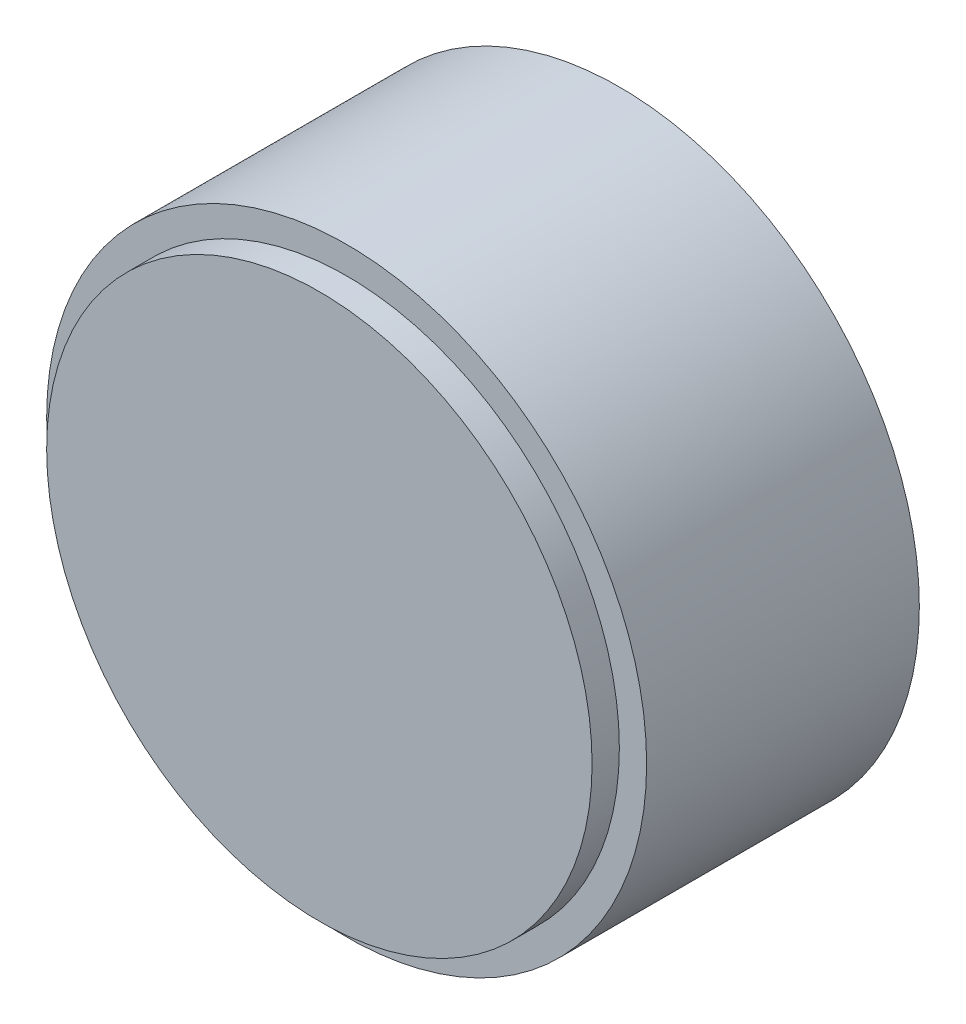
ISO-10303-21;
HEADER;
FILE_DESCRIPTION(('STEP AP214'),'2;1');
FILE_NAME('part.step','',(''),(''),'','','');
FILE_SCHEMA(('AUTOMOTIVE_DESIGN { 1 0 10303 214 1 1 1 1 }'));
ENDSEC;
DATA;
#1=APPLICATION_CONTEXT('core data for automotive mechanical design processes');
#2=APPLICATION_PROTOCOL_DEFINITION('international standard','automotive_design',2000,#1);
#3=PRODUCT_CONTEXT('',#1,'mechanical');
#4=PRODUCT('Part','Part','',(#3));
#5=PRODUCT_RELATED_PRODUCT_CATEGORY('part','',(#4));
#6=PRODUCT_DEFINITION_FORMATION('','',#4);
#7=PRODUCT_DEFINITION_CONTEXT('part definition',#1,'design');
#8=PRODUCT_DEFINITION('design','',#6,#7);
#9=PRODUCT_DEFINITION_SHAPE('','',#8);
#10=(LENGTH_UNIT() NAMED_UNIT(*) SI_UNIT(.MILLI.,.METRE.));
#11=(NAMED_UNIT(*) PLANE_ANGLE_UNIT() SI_UNIT($,.RADIAN.));
#12=(NAMED_UNIT(*) SI_UNIT($,.STERADIAN.) SOLID_ANGLE_UNIT());
#13=UNCERTAINTY_MEASURE_WITH_UNIT(LENGTH_MEASURE(1.E-05),#10,'distance_accuracy_value','');
#14=(GEOMETRIC_REPRESENTATION_CONTEXT(3) GLOBAL_UNCERTAINTY_ASSIGNED_CONTEXT((#13)) GLOBAL_UNIT_ASSIGNED_CONTEXT((#10,
#11,#12)) REPRESENTATION_CONTEXT('',''));
#15=CARTESIAN_POINT('',(0.,0.,0.));
#16=DIRECTION('',(0.,0.,1.));
#17=DIRECTION('',(1.,0.,0.));
#18=AXIS2_PLACEMENT_3D('',#15,#16,#17);
#19=CARTESIAN_POINT('',(0.,0.,-5.));
#20=DIRECTION('',(0.,0.,1.));
#21=DIRECTION('',(1.,0.,0.));
#22=AXIS2_PLACEMENT_3D('',#19,#20,#21);
#23=CYLINDRICAL_SURFACE('',#22,7.);
#24=CARTESIAN_POINT('',(0.,0.,-5.));
#25=DIRECTION('',(0.,0.,-1.));
#26=DIRECTION('',(-1.,0.,0.));
#27=AXIS2_PLACEMENT_3D('',#24,#25,#26);
#28=CIRCLE('',#27,7.);
#29=CARTESIAN_POINT('',(-7.,0.,-5.));
#30=VERTEX_POINT('',#29);
#31=EDGE_CURVE('E53',#30,#30,#28,.T.);
#32=ORIENTED_EDGE('',*,*,#31,.F.);
#33=EDGE_LOOP('',(#32));
#34=FACE_BOUND('',#33,.T.);
#35=CARTESIAN_POINT('',(0.,0.,0.));
#36=DIRECTION('',(0.,0.,-1.));
#37=DIRECTION('',(-1.,0.,0.));
#38=AXIS2_PLACEMENT_3D('',#35,#36,#37);
#39=CIRCLE('',#38,7.);
#40=CARTESIAN_POINT('',(-7.,0.,0.));
#41=VERTEX_POINT('',#40);
#42=EDGE_CURVE('E10',#41,#41,#39,.T.);
#43=ORIENTED_EDGE('',*,*,#42,.T.);
#44=EDGE_LOOP('',(#43));
#45=FACE_BOUND('',#44,.T.);
#46=CARTESIAN_POINT('',(0.,7.,-4.));
#47=CARTESIAN_POINT('',(-0.0832358860906166,6.99999846043226,-3.9999971004257));
#48=CARTESIAN_POINT('',(-0.166507195600275,6.9985002594971,-3.99304839161214));
#49=CARTESIAN_POINT('',(-0.330687344293327,6.99266829827728,-3.96546434314641));
#50=CARTESIAN_POINT('',(-0.41159440357119,6.98833245637099,-3.94481895580507));
#51=CARTESIAN_POINT('',(-0.568649323817737,6.97730831788827,-3.89051563539196));
#52=CARTESIAN_POINT('',(-0.644801963446556,6.97062242967171,-3.85687102061868));
#53=CARTESIAN_POINT('',(-0.790378177960787,6.95562106817971,-3.77756591382874));
#54=CARTESIAN_POINT('',(-0.859801981747369,6.94730565036661,-3.73190583075006));
#55=CARTESIAN_POINT('',(-0.991024790535229,6.92981369246311,-3.62911970032649));
#56=CARTESIAN_POINT('',(-1.05270503419445,6.92062683143259,-3.57184377810147));
#57=CARTESIAN_POINT('',(-1.16566042389435,6.90250069814144,-3.4477736843148));
#58=CARTESIAN_POINT('',(-1.21693467150908,6.8935614473163,-3.38097869174874));
#59=CARTESIAN_POINT('',(-1.30814204379809,6.87684116047225,-3.23889424713957));
#60=CARTESIAN_POINT('',(-1.34794958335009,6.8690733634436,-3.16352248224379));
#61=CARTESIAN_POINT('',(-1.41428823691148,6.85572325558537,-3.00696554623316));
#62=CARTESIAN_POINT('',(-1.44082087001716,6.85014069470711,-2.92578104150743));
#63=CARTESIAN_POINT('',(-1.47946574422454,6.84189808926311,-2.76118891341192));
#64=CARTESIAN_POINT('',(-1.49178779748342,6.83919556896486,-2.67783272433613));
#65=CARTESIAN_POINT('',(-1.50231395206577,6.83689139845106,-2.510195767493));
#66=CARTESIAN_POINT('',(-1.50051971664629,6.83728938291729,-2.42591510982005));
#67=CARTESIAN_POINT('',(-1.48303326340861,6.84110276603832,-2.26037531206621));
#68=CARTESIAN_POINT('',(-1.46758398649408,6.84446541682162,-2.17908911089985));
#69=CARTESIAN_POINT('',(-1.42361054298677,6.85374593375788,-2.02028975971066));
#70=CARTESIAN_POINT('',(-1.39508566936466,6.85966393808402,-1.94277681396768));
#71=CARTESIAN_POINT('',(-1.32554551075991,6.87344080755724,-1.79303712712666));
#72=CARTESIAN_POINT('',(-1.2844361097283,6.88131420983365,-1.72085548728745));
#73=CARTESIAN_POINT('',(-1.19096007283993,6.89810572501288,-1.58432483504204));
#74=CARTESIAN_POINT('',(-1.13859196103562,6.90702397481896,-1.5199768513138));
#75=CARTESIAN_POINT('',(-1.0227954275532,6.92512718393878,-1.3995406443266));
#76=CARTESIAN_POINT('',(-0.959160233964409,6.93431383972178,-1.34365129341526));
#77=CARTESIAN_POINT('',(-0.823317306269096,6.95175017497059,-1.24330626631034));
#78=CARTESIAN_POINT('',(-0.751109428775399,6.95999983875972,-1.19885078139961));
#79=CARTESIAN_POINT('',(-0.599933462049958,6.97465778534003,-1.12258932009307));
#80=CARTESIAN_POINT('',(-0.520952258863482,6.98106238643354,-1.09080858742202));
#81=CARTESIAN_POINT('',(-0.358603146685706,6.99128109245334,-1.04102435167891));
#82=CARTESIAN_POINT('',(-0.275235851133668,6.99509555860384,-1.02301892743668));
#83=CARTESIAN_POINT('',(-0.108187670836628,6.99965306347808,-1.00158378585658));
#84=CARTESIAN_POINT('',(-0.0245431772716141,7.00045336521066,-0.99788228711822));
#85=CARTESIAN_POINT('',(0.142168973650405,6.99905248935969,-1.00442457112516));
#86=CARTESIAN_POINT('',(0.225236668127256,6.99685150675698,-1.01466744796294));
#87=CARTESIAN_POINT('',(0.387542537982806,6.98973143045266,-1.0485822436617));
#88=CARTESIAN_POINT('',(0.466811712908478,6.9848410504546,-1.07211236947253));
#89=CARTESIAN_POINT('',(0.620278450473418,6.9728892442151,-1.13177694299482));
#90=CARTESIAN_POINT('',(0.69447559258774,6.96582763822237,-1.16791243431165));
#91=CARTESIAN_POINT('',(0.836821397964754,6.950175043904,-1.25233354306033));
#92=CARTESIAN_POINT('',(0.90487257511114,6.94156431354275,-1.30077979490973));
#93=CARTESIAN_POINT('',(1.0319769255236,6.92381033034847,-1.40823482488874));
#94=CARTESIAN_POINT('',(1.091028978692,6.91466701142097,-1.46724491588744));
#95=CARTESIAN_POINT('',(1.19952711057989,6.89668172706324,-1.59539737018714));
#96=CARTESIAN_POINT('',(1.24878537255157,6.88784792221285,-1.6647000992221));
#97=CARTESIAN_POINT('',(1.3349641538604,6.87166654559681,-1.81075459647799));
#98=CARTESIAN_POINT('',(1.37188519913706,6.86431891048055,-1.88750604697749));
#99=CARTESIAN_POINT('',(1.43209741248548,6.8520100980739,-2.0458722989946));
#100=CARTESIAN_POINT('',(1.45546398641275,6.84703574582967,-2.12745735643067));
#101=CARTESIAN_POINT('',(1.48812696085335,6.84001186708418,-2.29351558383364));
#102=CARTESIAN_POINT('',(1.49742550780258,6.83796189439706,-2.37798831120132));
#103=CARTESIAN_POINT('',(1.5015999992604,6.83704618848155,-2.54553234317524));
#104=CARTESIAN_POINT('',(1.49677347258311,6.83811476518543,-2.62859601498058));
#105=CARTESIAN_POINT('',(1.47349789406331,6.8431676318483,-2.79269724213259));
#106=CARTESIAN_POINT('',(1.45504898957979,6.84715189026714,-2.87373481938657));
#107=CARTESIAN_POINT('',(1.40519345940434,6.85755581104157,-3.03125865786917));
#108=CARTESIAN_POINT('',(1.37382847170887,6.86396764224703,-3.10775864866429));
#109=CARTESIAN_POINT('',(1.29906751595601,6.87850764590649,-3.25445537250685));
#110=CARTESIAN_POINT('',(1.255670353015,6.88663598880363,-3.32465147861504));
#111=CARTESIAN_POINT('',(1.15708290349304,6.90389055593232,-3.45821819372537));
#112=CARTESIAN_POINT('',(1.10167987421237,6.91303309938926,-3.52142969594698));
#113=CARTESIAN_POINT('',(0.981086554619619,6.93117449799694,-3.63775626252046));
#114=CARTESIAN_POINT('',(0.915894009385596,6.94017331951296,-3.69086899431221));
#115=CARTESIAN_POINT('',(0.776603147268716,6.95714491048987,-3.78611595950556));
#116=CARTESIAN_POINT('',(0.702404846009641,6.96510364570626,-3.82810660623098));
#117=CARTESIAN_POINT('',(0.547850160940598,6.97895826104019,-3.89895452890618));
#118=CARTESIAN_POINT('',(0.467499105863879,6.98485590212343,-3.92782302258504));
#119=CARTESIAN_POINT('',(0.322535217553203,6.99284848461772,-3.96635218513115));
#120=CARTESIAN_POINT('',(0.258717205545978,6.99551391888263,-3.97894643398003));
#121=CARTESIAN_POINT('',(0.129939960853846,6.99909024154719,-3.99577130171167));
#122=CARTESIAN_POINT('',(0.0649807750887446,7.00000120191314,-4.00000226364606));
#123=CARTESIAN_POINT('',(0.,7.,-4.));
#124=B_SPLINE_CURVE_WITH_KNOTS('',3,(#46,#47,#48,#49,#50,#51,#52,#53,#54,#55,#56,#57,#58,#59,
#60,#61,#62,#63,#64,#65,#66,#67,#68,#69,#70,#71,#72,#73,#74,#75,#76,#77,#78,#79,#80,#81,#82,#83,
#84,#85,#86,#87,#88,#89,#90,#91,#92,#93,#94,#95,#96,#97,#98,#99,#100,#101,#102,#103,#104,#105,
#106,#107,#108,#109,#110,#111,#112,#113,#114,#115,#116,#117,#118,#119,#120,#121,#122,#123),
.UNSPECIFIED.,.T.,.F.,(4,2,2,2,2,2,2,2,2,2,2,2,2,2,2,2,2,2,2,2,2,2,2,2,2,2,2,2,2,2,2,2,2,2,2,2,
2,2,4),(0.,0.249469836512082,0.499122883219936,0.748520824425602,0.997910278645886,
1.25074961881732,1.50361077918506,1.7591442921451,2.0146485567749,2.26633008124666,
2.51798195169165,2.76524475452928,3.01252092904568,3.26169356165968,3.51089887920889,
3.76527011050291,4.0196455970235,4.27452521139806,4.52936927256343,4.77934665704185,
5.02930780231429,5.27665060589267,5.52401389198434,5.77478733867803,6.02559197304485,
6.28082063283534,6.53603841075806,6.78982240408475,7.04356767229185,7.29200680540294,
7.5404432510827,7.78808499706785,8.03575134451623,8.28822950154114,8.54076590397115,
8.79641910357222,9.05185334010271,9.24661799132294,9.44137465337336),.UNSPECIFIED.);
#125=CARTESIAN_POINT('',(0.,7.,-4.));
#126=VERTEX_POINT('',#125);
#127=EDGE_CURVE('E103',#126,#126,#124,.T.);
#128=ORIENTED_EDGE('',*,*,#127,.F.);
#129=EDGE_LOOP('',(#128));
#130=FACE_BOUND('',#129,.T.);
#131=ADVANCED_FACE('F32',(#34,#45,#130),#23,.T.);
#132=CARTESIAN_POINT('',(0.,0.,-5.));
#133=DIRECTION('',(0.,0.,1.));
#134=DIRECTION('',(1.,0.,0.));
#135=AXIS2_PLACEMENT_3D('',#132,#133,#134);
#136=CYLINDRICAL_SURFACE('',#135,2.);
#137=CARTESIAN_POINT('',(0.,0.,0.));
#138=DIRECTION('',(0.,0.,-1.));
#139=DIRECTION('',(-1.,0.,0.));
#140=AXIS2_PLACEMENT_3D('',#137,#138,#139);
#141=CIRCLE('',#140,2.);
#142=CARTESIAN_POINT('',(-2.,0.,0.));
#143=VERTEX_POINT('',#142);
#144=EDGE_CURVE('E109',#143,#143,#141,.T.);
#145=ORIENTED_EDGE('',*,*,#144,.F.);
#146=EDGE_LOOP('',(#145));
#147=FACE_BOUND('',#146,.T.);
#148=CARTESIAN_POINT('',(0.,0.,-5.));
#149=DIRECTION('',(0.,0.,-1.));
#150=DIRECTION('',(-1.,0.,0.));
#151=AXIS2_PLACEMENT_3D('',#148,#149,#150);
#152=CIRCLE('',#151,2.);
#153=CARTESIAN_POINT('',(-2.,0.,-5.));
#154=VERTEX_POINT('',#153);
#155=EDGE_CURVE('E110',#154,#154,#152,.T.);
#156=ORIENTED_EDGE('',*,*,#155,.T.);
#157=EDGE_LOOP('',(#156));
#158=FACE_BOUND('',#157,.T.);
#159=CARTESIAN_POINT('',(0.,2.,-4.));
#160=CARTESIAN_POINT('',(-0.0732207358411543,1.99999540196395,-3.99999520798798));
#161=CARTESIAN_POINT('',(-0.146561062021485,1.99593645526274,-3.9945949756255));
#162=CARTESIAN_POINT('',(-0.290936396286467,1.98006607281083,-3.97333293658984));
#163=CARTESIAN_POINT('',(-0.361965136229004,1.96823514679854,-3.95744482834995));
#164=CARTESIAN_POINT('',(-0.499234626631249,1.9379567495606,-3.91628709071623));
#165=CARTESIAN_POINT('',(-0.565501615403737,1.91954951932009,-3.89107448643083));
#166=CARTESIAN_POINT('',(-0.692422335520753,1.87750556721694,-3.83245765581277));
#167=CARTESIAN_POINT('',(-0.753077701796332,1.85387037535483,-3.79905582580648));
#168=CARTESIAN_POINT('',(-0.873465937590145,1.80049544543983,-3.72173698840918));
#169=CARTESIAN_POINT('',(-0.932593229272032,1.7703930854844,-3.67713267066593));
#170=CARTESIAN_POINT('',(-1.04302716767671,1.70767017883378,-3.58050416263883));
#171=CARTESIAN_POINT('',(-1.09432148272226,1.67504578078609,-3.52846851720017));
#172=CARTESIAN_POINT('',(-1.19837161436623,1.6027112365199,-3.40641704672163));
#173=CARTESIAN_POINT('',(-1.24930578421204,1.56290854864639,-3.3348963228783));
#174=CARTESIAN_POINT('',(-1.33861998176348,1.48711444664135,-3.18254898763345));
#175=CARTESIAN_POINT('',(-1.37701716983077,1.45111786883675,-3.10173530299969));
#176=CARTESIAN_POINT('',(-1.42880627811788,1.39977155180179,-2.96049716132377));
#177=CARTESIAN_POINT('',(-1.44625674456539,1.38157751186733,-2.90260930287162));
#178=CARTESIAN_POINT('',(-1.47420672564844,1.35171594150685,-2.78360726521508));
#179=CARTESIAN_POINT('',(-1.48472215355267,1.34003347910832,-2.72250082212521));
#180=CARTESIAN_POINT('',(-1.49812822141445,1.32503759684553,-2.59781741446923));
#181=CARTESIAN_POINT('',(-1.50094954854207,1.32180026676597,-2.53422319327594));
#182=CARTESIAN_POINT('',(-1.49848213241869,1.32459531776068,-2.40738508911843));
#183=CARTESIAN_POINT('',(-1.49319048157349,1.33063102218113,-2.34414133991256));
#184=CARTESIAN_POINT('',(-1.47597739291882,1.34967623262519,-2.22680865257421));
#185=CARTESIAN_POINT('',(-1.46482486380817,1.36187157059871,-2.17246362895382));
#186=CARTESIAN_POINT('',(-1.43705671120732,1.39114192844939,-2.06656112127912));
#187=CARTESIAN_POINT('',(-1.42043583681172,1.40822163640769,-2.0150063721764));
#188=CARTESIAN_POINT('',(-1.37033064172535,1.45741769294306,-1.88374361336585));
#189=CARTESIAN_POINT('',(-1.3328014849398,1.49225649139233,-1.80659958335649));
#190=CARTESIAN_POINT('',(-1.24618023314519,1.56533298145196,-1.66080347613092));
#191=CARTESIAN_POINT('',(-1.19706004255878,1.60357878886109,-1.59217266074534));
#192=CARTESIAN_POINT('',(-1.08651604102135,1.68051672313145,-1.46224660959635));
#193=CARTESIAN_POINT('',(-1.02481375526036,1.71919586730239,-1.40117939311852));
#194=CARTESIAN_POINT('',(-0.890422521709589,1.79248037980972,-1.28973635321884));
#195=CARTESIAN_POINT('',(-0.817755054293756,1.8270934826376,-1.23934007976962));
#196=CARTESIAN_POINT('',(-0.677902080454142,1.88279726073643,-1.16001920075967));
#197=CARTESIAN_POINT('',(-0.612539870185619,1.90520770945008,-1.12881540578422));
#198=CARTESIAN_POINT('',(-0.476352173202086,1.94372904416948,-1.07577511953614));
#199=CARTESIAN_POINT('',(-0.405530141063765,1.95984387504352,-1.05393276150072));
#200=CARTESIAN_POINT('',(-0.259676232483518,1.98445588635989,-1.02074663711356));
#201=CARTESIAN_POINT('',(-0.184621281405942,1.99290592971749,-1.00946782106137));
#202=CARTESIAN_POINT('',(-0.0332012397969162,2.00115883659445,-0.998450402628294));
#203=CARTESIAN_POINT('',(0.0431632843727241,2.00096534845408,-0.998706931304634));
#204=CARTESIAN_POINT('',(0.186804217329626,1.99242547175873,-1.01011086927319));
#205=CARTESIAN_POINT('',(0.254222327546133,1.98490086600401,-1.02016053688867));
#206=CARTESIAN_POINT('',(0.386110670609118,1.96351320201588,-1.04897378000787));
#207=CARTESIAN_POINT('',(0.450580272987261,1.94964879507262,-1.06773920968941));
#208=CARTESIAN_POINT('',(0.57741677968977,1.91599830683313,-1.1138875305931));
#209=CARTESIAN_POINT('',(0.639629172536139,1.89602050290193,-1.1415511814274));
#210=CARTESIAN_POINT('',(0.758518527043073,1.85166985411963,-1.20417245542559));
#211=CARTESIAN_POINT('',(0.815194721336403,1.82729640132068,-1.23913108763974));
#212=CARTESIAN_POINT('',(0.931511626319037,1.77119146886499,-1.32178324641056));
#213=CARTESIAN_POINT('',(0.990066762698702,1.73891095025037,-1.37062853943746));
#214=CARTESIAN_POINT('',(1.09871974855854,1.67238952874785,-1.47600875258839));
#215=CARTESIAN_POINT('',(1.14879830469577,1.63814438507395,-1.53256069969336));
#216=CARTESIAN_POINT('',(1.24877541075626,1.56369128291497,-1.66414988096118));
#217=CARTESIAN_POINT('',(1.29683043648705,1.523587185201,-1.7406575614923));
#218=CARTESIAN_POINT('',(1.37923235998283,1.4494059134845,-1.90336007797245));
#219=CARTESIAN_POINT('',(1.41362000515519,1.41531099570969,-1.98952512190858));
#220=CARTESIAN_POINT('',(1.45615734256767,1.37118877808583,-2.13541444887448));
#221=CARTESIAN_POINT('',(1.46931009512996,1.35695811824565,-2.19239112640238));
#222=CARTESIAN_POINT('',(1.48891522181906,1.33542056103011,-2.30870704698318));
#223=CARTESIAN_POINT('',(1.4953825519924,1.32809821220233,-2.36804070680225));
#224=CARTESIAN_POINT('',(1.50115320209064,1.32157601792209,-2.48782907981133));
#225=CARTESIAN_POINT('',(1.50042015325262,1.32241740684975,-2.54828794300957));
#226=CARTESIAN_POINT('',(1.49176883838219,1.33216448543666,-2.66805683875216));
#227=CARTESIAN_POINT('',(1.48384130024584,1.34108058157484,-2.72736528789726));
#228=CARTESIAN_POINT('',(1.45893841819723,1.36817348797773,-2.8559145714108));
#229=CARTESIAN_POINT('',(1.44036567954111,1.38794705950643,-2.92449718013277));
#230=CARTESIAN_POINT('',(1.39469627266119,1.4338296338541,-3.05653484883048));
#231=CARTESIAN_POINT('',(1.3675780729773,1.4599546014693,-3.11997644203819));
#232=CARTESIAN_POINT('',(1.29498918933642,1.52516477328824,-3.26252063048633));
#233=CARTESIAN_POINT('',(1.2464154206597,1.56560203191105,-3.33942158275575));
#234=CARTESIAN_POINT('',(1.13650718465936,1.64713510181273,-3.48312604497756));
#235=CARTESIAN_POINT('',(1.07516134758577,1.68823146954222,-3.54992046594485));
#236=CARTESIAN_POINT('',(0.93962714493789,1.76728988939793,-3.67283184228333));
#237=CARTESIAN_POINT('',(0.865337161562859,1.80522333711072,-3.7288563193772));
#238=CARTESIAN_POINT('',(0.705159098936202,1.87357289668097,-3.82722305114535));
#239=CARTESIAN_POINT('',(0.619299420401793,1.90400691592959,-3.86959797457251));
#240=CARTESIAN_POINT('',(0.464840290356453,1.94636704624048,-3.92779942098571));
#241=CARTESIAN_POINT('',(0.398553614774731,1.96110322499718,-3.94776673137617));
#242=CARTESIAN_POINT('',(0.262841610392759,1.98383739970238,-3.97841790261149));
#243=CARTESIAN_POINT('',(0.193425623834904,1.99185421210894,-3.98912769024996));
#244=CARTESIAN_POINT('',(0.102963309861888,1.99745471706309,-3.99660469421435));
#245=CARTESIAN_POINT('',(0.0824069459941229,1.9984076143208,-3.99787627748942));
#246=CARTESIAN_POINT('',(0.0412368896243779,1.99968095423138,-3.99957467323097));
#247=CARTESIAN_POINT('',(0.0206231884283879,2.00000129507253,-4.00000134970737));
#248=CARTESIAN_POINT('',(0.,2.,-4.));
#249=B_SPLINE_CURVE_WITH_KNOTS('',3,(#159,#160,#161,#162,#163,#164,#165,#166,#167,#168,#169,
#170,#171,#172,#173,#174,#175,#176,#177,#178,#179,#180,#181,#182,#183,#184,#185,#186,#187,#188,
#189,#190,#191,#192,#193,#194,#195,#196,#197,#198,#199,#200,#201,#202,#203,#204,#205,#206,#207,
#208,#209,#210,#211,#212,#213,#214,#215,#216,#217,#218,#219,#220,#221,#222,#223,#224,#225,#226,
#227,#228,#229,#230,#231,#232,#233,#234,#235,#236,#237,#238,#239,#240,#241,#242,#243,#244,#245,
#246,#247,#248),.UNSPECIFIED.,.T.,.F.,(4,2,2,2,2,2,2,2,2,2,2,2,2,2,2,2,2,2,2,2,2,2,2,2,2,2,2,2,
2,2,2,2,2,2,2,2,2,2,2,2,2,2,2,2,4),(0.,0.219571786572042,0.439696319423243,0.658496333573381,
0.877232398849293,1.1162243131743,1.35558868405162,1.64360015887451,1.93121574056507,
2.11999518529901,2.3083399319529,2.49837587621257,2.6884799430021,2.85826890162709,
3.0282213760064,3.3044933180591,3.58144192357889,3.8653588393809,4.14872662493691,
4.37526505006389,4.60166129643117,4.82944058166898,5.05712372466613,5.26191187011994,
5.46674360185812,5.6788043948368,5.89089453977541,6.13840382081868,6.38646908985452,
6.68168596015947,6.97601595850113,7.15589161422933,7.33536399114208,7.51574333854741,
7.69635548563854,7.91639670960134,8.13699685139921,8.43412246655768,8.73151372390893,
9.0313544949265,9.33047220273164,9.5419569754163,9.75284752283256,9.81468166878711,
9.87652576630966),.UNSPECIFIED.);
#250=CARTESIAN_POINT('',(0.,2.,-4.));
#251=VERTEX_POINT('',#250);
#252=EDGE_CURVE('E36',#251,#251,#249,.T.);
#253=ORIENTED_EDGE('',*,*,#252,.T.);
#254=EDGE_LOOP('',(#253));
#255=FACE_BOUND('',#254,.T.);
#256=ADVANCED_FACE('F91',(#147,#158,#255),#136,.F.);
#257=CARTESIAN_POINT('',(0.,0.,35.));
#258=DIRECTION('',(0.,0.,-1.));
#259=DIRECTION('',(-1.,0.,0.));
#260=AXIS2_PLACEMENT_3D('',#257,#258,#259);
#261=CYLINDRICAL_SURFACE('',#260,30.);
#262=CARTESIAN_POINT('',(0.,0.,35.));
#263=DIRECTION('',(0.,0.,1.));
#264=DIRECTION('',(1.,0.,0.));
#265=AXIS2_PLACEMENT_3D('',#262,#263,#264);
#266=CIRCLE('',#265,30.);
#267=CARTESIAN_POINT('',(30.,0.,35.));
#268=VERTEX_POINT('',#267);
#269=EDGE_CURVE('E50',#268,#268,#266,.T.);
#270=ORIENTED_EDGE('',*,*,#269,.F.);
#271=EDGE_LOOP('',(#270));
#272=FACE_BOUND('',#271,.T.);
#273=CARTESIAN_POINT('',(0.,0.,32.));
#274=DIRECTION('',(0.,0.,-1.));
#275=DIRECTION('',(-1.,0.,0.));
#276=AXIS2_PLACEMENT_3D('',#273,#274,#275);
#277=CIRCLE('',#276,30.);
#278=CARTESIAN_POINT('',(-30.,0.,32.));
#279=VERTEX_POINT('',#278);
#280=EDGE_CURVE('E45',#279,#279,#277,.T.);
#281=ORIENTED_EDGE('',*,*,#280,.F.);
#282=EDGE_LOOP('',(#281));
#283=FACE_BOUND('',#282,.T.);
#284=ADVANCED_FACE('F82',(#272,#283),#261,.T.);
#285=CARTESIAN_POINT('',(0.,0.,35.));
#286=DIRECTION('',(0.,0.,1.));
#287=DIRECTION('',(1.,0.,0.));
#288=AXIS2_PLACEMENT_3D('',#285,#286,#287);
#289=PLANE('',#288);
#290=ORIENTED_EDGE('',*,*,#269,.T.);
#291=EDGE_LOOP('',(#290));
#292=FACE_BOUND('',#291,.T.);
#293=ADVANCED_FACE('F153',(#292),#289,.T.);
#294=CARTESIAN_POINT('',(0.,0.,32.));
#295=DIRECTION('',(0.,0.,-1.));
#296=DIRECTION('',(-1.,0.,0.));
#297=AXIS2_PLACEMENT_3D('',#294,#295,#296);
#298=CYLINDRICAL_SURFACE('',#297,33.);
#299=CARTESIAN_POINT('',(0.,0.,32.));
#300=DIRECTION('',(0.,0.,-1.));
#301=DIRECTION('',(-1.,0.,0.));
#302=AXIS2_PLACEMENT_3D('',#299,#300,#301);
#303=CIRCLE('',#302,33.);
#304=CARTESIAN_POINT('',(-33.,0.,32.));
#305=VERTEX_POINT('',#304);
#306=EDGE_CURVE('E59',#305,#305,#303,.T.);
#307=ORIENTED_EDGE('',*,*,#306,.T.);
#308=EDGE_LOOP('',(#307));
#309=FACE_BOUND('',#308,.T.);
#310=CARTESIAN_POINT('',(0.,0.,2.));
#311=DIRECTION('',(0.,0.,-1.));
#312=DIRECTION('',(-1.,0.,0.));
#313=AXIS2_PLACEMENT_3D('',#310,#311,#312);
#314=CIRCLE('',#313,33.);
#315=CARTESIAN_POINT('',(-33.,0.,2.));
#316=VERTEX_POINT('',#315);
#317=EDGE_CURVE('E58',#316,#316,#314,.T.);
#318=ORIENTED_EDGE('',*,*,#317,.F.);
#319=EDGE_LOOP('',(#318));
#320=FACE_BOUND('',#319,.T.);
#321=ADVANCED_FACE('F165',(#309,#320),#298,.T.);
#322=CARTESIAN_POINT('',(0.,0.,32.));
#323=DIRECTION('',(0.,0.,-1.));
#324=DIRECTION('',(-1.,0.,0.));
#325=AXIS2_PLACEMENT_3D('',#322,#323,#324);
#326=PLANE('',#325);
#327=ORIENTED_EDGE('',*,*,#280,.T.);
#328=EDGE_LOOP('',(#327));
#329=FACE_BOUND('',#328,.T.);
#330=ORIENTED_EDGE('',*,*,#306,.F.);
#331=EDGE_LOOP('',(#330));
#332=FACE_BOUND('',#331,.T.);
#333=ADVANCED_FACE('F83',(#329,#332),#326,.F.);
#334=CARTESIAN_POINT('',(0.,0.,2.));
#335=DIRECTION('',(0.,0.,-1.));
#336=DIRECTION('',(-1.,0.,0.));
#337=AXIS2_PLACEMENT_3D('',#334,#335,#336);
#338=PLANE('',#337);
#339=CARTESIAN_POINT('',(0.,0.,2.));
#340=DIRECTION('',(0.,0.,-1.));
#341=DIRECTION('',(-1.,0.,0.));
#342=AXIS2_PLACEMENT_3D('',#339,#340,#341);
#343=CIRCLE('',#342,30.);
#344=CARTESIAN_POINT('',(-30.,0.,2.));
#345=VERTEX_POINT('',#344);
#346=EDGE_CURVE('E55',#345,#345,#343,.T.);
#347=ORIENTED_EDGE('',*,*,#346,.F.);
#348=EDGE_LOOP('',(#347));
#349=FACE_BOUND('',#348,.T.);
#350=ORIENTED_EDGE('',*,*,#317,.T.);
#351=EDGE_LOOP('',(#350));
#352=FACE_BOUND('',#351,.T.);
#353=ADVANCED_FACE('F73',(#349,#352),#338,.T.);
#354=CARTESIAN_POINT('',(0.,0.,0.));
#355=DIRECTION('',(0.,0.,1.));
#356=DIRECTION('',(1.,0.,0.));
#357=AXIS2_PLACEMENT_3D('',#354,#355,#356);
#358=PLANE('',#357);
#359=ORIENTED_EDGE('',*,*,#42,.F.);
#360=EDGE_LOOP('',(#359));
#361=FACE_BOUND('',#360,.T.);
#362=CARTESIAN_POINT('',(0.,0.,0.));
#363=DIRECTION('',(0.,0.,1.));
#364=DIRECTION('',(1.,0.,0.));
#365=AXIS2_PLACEMENT_3D('',#362,#363,#364);
#366=CIRCLE('',#365,30.);
#367=CARTESIAN_POINT('',(30.,0.,0.));
#368=VERTEX_POINT('',#367);
#369=EDGE_CURVE('E62',#368,#368,#366,.T.);
#370=ORIENTED_EDGE('',*,*,#369,.F.);
#371=EDGE_LOOP('',(#370));
#372=FACE_BOUND('',#371,.T.);
#373=ADVANCED_FACE('F71',(#361,#372),#358,.F.);
#374=ORIENTED_EDGE('',*,*,#346,.T.);
#375=EDGE_LOOP('',(#374));
#376=FACE_BOUND('',#375,.T.);
#377=ORIENTED_EDGE('',*,*,#369,.T.);
#378=EDGE_LOOP('',(#377));
#379=FACE_BOUND('',#378,.T.);
#380=ADVANCED_FACE('F34',(#376,#379),#261,.T.);
#381=CARTESIAN_POINT('',(0.,0.,-5.));
#382=DIRECTION('',(0.,0.,-1.));
#383=DIRECTION('',(-1.,0.,0.));
#384=AXIS2_PLACEMENT_3D('',#381,#382,#383);
#385=PLANE('',#384);
#386=ORIENTED_EDGE('',*,*,#31,.T.);
#387=EDGE_LOOP('',(#386));
#388=FACE_BOUND('',#387,.T.);
#389=ORIENTED_EDGE('',*,*,#155,.F.);
#390=EDGE_LOOP('',(#389));
#391=FACE_BOUND('',#390,.T.);
#392=ADVANCED_FACE('F80',(#388,#391),#385,.T.);
#393=ORIENTED_EDGE('',*,*,#144,.T.);
#394=EDGE_LOOP('',(#393));
#395=FACE_BOUND('',#394,.T.);
#396=ADVANCED_FACE('F75',(#395),#358,.F.);
#397=CARTESIAN_POINT('',(0.,33.,-2.5));
#398=DIRECTION('',(0.,-1.,0.));
#399=DIRECTION('',(0.,0.,-1.));
#400=AXIS2_PLACEMENT_3D('',#397,#398,#399);
#401=CYLINDRICAL_SURFACE('',#400,1.5);
#402=ORIENTED_EDGE('',*,*,#252,.F.);
#403=EDGE_LOOP('',(#402));
#404=FACE_BOUND('',#403,.T.);
#405=ORIENTED_EDGE('',*,*,#127,.T.);
#406=EDGE_LOOP('',(#405));
#407=FACE_BOUND('',#406,.T.);
#408=ADVANCED_FACE('F88',(#404,#407),#401,.F.);
#409=CLOSED_SHELL('',(#131,#256,#284,#293,#321,#333,#353,#373,#380,#392,#396,#408));
#410=MANIFOLD_SOLID_BREP('B2',#409);
#411=ADVANCED_BREP_SHAPE_REPRESENTATION('',(#18,#410),#14);
#412=SHAPE_DEFINITION_REPRESENTATION(#9,#411);
ENDSEC;
END-ISO-10303-21;
